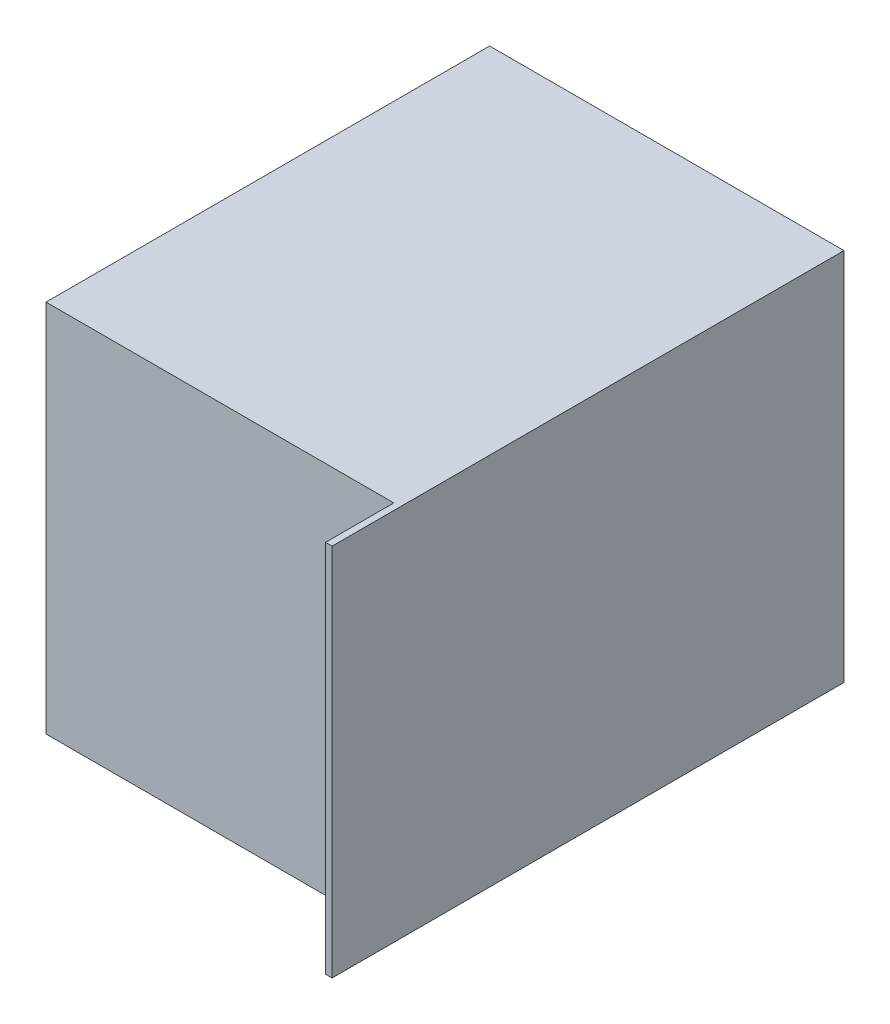
ISO-10303-21;
HEADER;
FILE_DESCRIPTION(('STEP AP214'),'2;1');
FILE_NAME('part.step','',(''),(''),'','','');
FILE_SCHEMA(('AUTOMOTIVE_DESIGN { 1 0 10303 214 1 1 1 1 }'));
ENDSEC;
DATA;
#1=APPLICATION_CONTEXT('core data for automotive mechanical design processes');
#2=APPLICATION_PROTOCOL_DEFINITION('international standard','automotive_design',2000,#1);
#3=PRODUCT_CONTEXT('',#1,'mechanical');
#4=PRODUCT('Part','Part','',(#3));
#5=PRODUCT_RELATED_PRODUCT_CATEGORY('part','',(#4));
#6=PRODUCT_DEFINITION_FORMATION('','',#4);
#7=PRODUCT_DEFINITION_CONTEXT('part definition',#1,'design');
#8=PRODUCT_DEFINITION('design','',#6,#7);
#9=PRODUCT_DEFINITION_SHAPE('','',#8);
#10=(LENGTH_UNIT() NAMED_UNIT(*) SI_UNIT(.MILLI.,.METRE.));
#11=(NAMED_UNIT(*) PLANE_ANGLE_UNIT() SI_UNIT($,.RADIAN.));
#12=(NAMED_UNIT(*) SI_UNIT($,.STERADIAN.) SOLID_ANGLE_UNIT());
#13=UNCERTAINTY_MEASURE_WITH_UNIT(LENGTH_MEASURE(1.E-05),#10,'distance_accuracy_value','');
#14=(GEOMETRIC_REPRESENTATION_CONTEXT(3) GLOBAL_UNCERTAINTY_ASSIGNED_CONTEXT((#13)) GLOBAL_UNIT_ASSIGNED_CONTEXT((#10,
#11,#12)) REPRESENTATION_CONTEXT('',''));
#15=CARTESIAN_POINT('',(0.,0.,0.));
#16=DIRECTION('',(0.,0.,1.));
#17=DIRECTION('',(1.,0.,0.));
#18=AXIS2_PLACEMENT_3D('',#15,#16,#17);
#19=CARTESIAN_POINT('',(12.5726141078839,57.,39.));
#20=DIRECTION('',(-1.,0.,0.));
#21=DIRECTION('',(0.,0.,1.));
#22=AXIS2_PLACEMENT_3D('',#19,#20,#21);
#23=PLANE('',#22);
#24=DIRECTION('',(0.,0.,-1.));
#25=VECTOR('',#24,1.);
#26=CARTESIAN_POINT('',(12.5726141078839,0.,39.));
#27=LINE('',#26,#25);
#28=CARTESIAN_POINT('',(12.5726141078839,0.,39.));
#29=VERTEX_POINT('',#28);
#30=CARTESIAN_POINT('',(12.5726141078839,0.,-39.));
#31=VERTEX_POINT('',#30);
#32=EDGE_CURVE('E117',#29,#31,#27,.T.);
#33=ORIENTED_EDGE('',*,*,#32,.T.);
#34=DIRECTION('',(0.,-1.,0.));
#35=VECTOR('',#34,1.);
#36=CARTESIAN_POINT('',(12.5726141078839,57.,-39.));
#37=LINE('',#36,#35);
#38=CARTESIAN_POINT('',(12.5726141078839,57.,-39.));
#39=VERTEX_POINT('',#38);
#40=EDGE_CURVE('E11',#39,#31,#37,.T.);
#41=ORIENTED_EDGE('',*,*,#40,.F.);
#42=DIRECTION('',(0.,0.,-1.));
#43=VECTOR('',#42,1.);
#44=CARTESIAN_POINT('',(12.5726141078839,57.,39.));
#45=LINE('',#44,#43);
#46=CARTESIAN_POINT('',(12.5726141078839,57.,39.));
#47=VERTEX_POINT('',#46);
#48=EDGE_CURVE('E128',#47,#39,#45,.T.);
#49=ORIENTED_EDGE('',*,*,#48,.F.);
#50=DIRECTION('',(0.,-1.,0.));
#51=VECTOR('',#50,1.);
#52=CARTESIAN_POINT('',(12.5726141078839,57.,39.));
#53=LINE('',#52,#51);
#54=EDGE_CURVE('E113',#47,#29,#53,.T.);
#55=ORIENTED_EDGE('',*,*,#54,.T.);
#56=EDGE_LOOP('',(#33,#41,#49,#55));
#57=FACE_BOUND('',#56,.T.);
#58=ADVANCED_FACE('F33',(#57),#23,.F.);
#59=CARTESIAN_POINT('',(-41.4273858921161,57.,-39.));
#60=DIRECTION('',(0.,0.,1.));
#61=DIRECTION('',(1.,0.,0.));
#62=AXIS2_PLACEMENT_3D('',#59,#60,#61);
#63=PLANE('',#62);
#64=DIRECTION('',(-1.,0.,0.));
#65=VECTOR('',#64,1.);
#66=CARTESIAN_POINT('',(-41.4273858921161,0.,-39.));
#67=LINE('',#66,#65);
#68=CARTESIAN_POINT('',(-41.4273858921161,0.,-39.));
#69=VERTEX_POINT('',#68);
#70=EDGE_CURVE('E120',#31,#69,#67,.T.);
#71=ORIENTED_EDGE('',*,*,#70,.T.);
#72=DIRECTION('',(0.,-1.,0.));
#73=VECTOR('',#72,1.);
#74=CARTESIAN_POINT('',(-41.4273858921161,57.,-39.));
#75=LINE('',#74,#73);
#76=CARTESIAN_POINT('',(-41.4273858921161,57.,-39.));
#77=VERTEX_POINT('',#76);
#78=EDGE_CURVE('E41',#77,#69,#75,.T.);
#79=ORIENTED_EDGE('',*,*,#78,.F.);
#80=DIRECTION('',(-1.,0.,0.));
#81=VECTOR('',#80,1.);
#82=CARTESIAN_POINT('',(-41.4273858921161,57.,-39.));
#83=LINE('',#82,#81);
#84=EDGE_CURVE('E86',#39,#77,#83,.T.);
#85=ORIENTED_EDGE('',*,*,#84,.F.);
#86=ORIENTED_EDGE('',*,*,#40,.T.);
#87=EDGE_LOOP('',(#71,#79,#85,#86));
#88=FACE_BOUND('',#87,.T.);
#89=ADVANCED_FACE('F152',(#88),#63,.F.);
#90=CARTESIAN_POINT('',(-41.4273858921161,57.,28.6));
#91=DIRECTION('',(1.,0.,0.));
#92=DIRECTION('',(0.,0.,-1.));
#93=AXIS2_PLACEMENT_3D('',#90,#91,#92);
#94=PLANE('',#93);
#95=DIRECTION('',(0.,0.,1.));
#96=VECTOR('',#95,1.);
#97=CARTESIAN_POINT('',(-41.4273858921161,0.,28.6));
#98=LINE('',#97,#96);
#99=CARTESIAN_POINT('',(-41.4273858921161,0.,28.6));
#100=VERTEX_POINT('',#99);
#101=EDGE_CURVE('E123',#69,#100,#98,.T.);
#102=ORIENTED_EDGE('',*,*,#101,.T.);
#103=DIRECTION('',(0.,-1.,0.));
#104=VECTOR('',#103,1.);
#105=CARTESIAN_POINT('',(-41.4273858921161,57.,28.6));
#106=LINE('',#105,#104);
#107=CARTESIAN_POINT('',(-41.4273858921161,57.,28.6));
#108=VERTEX_POINT('',#107);
#109=EDGE_CURVE('E108',#108,#100,#106,.T.);
#110=ORIENTED_EDGE('',*,*,#109,.F.);
#111=DIRECTION('',(0.,0.,1.));
#112=VECTOR('',#111,1.);
#113=CARTESIAN_POINT('',(-41.4273858921161,57.,28.6));
#114=LINE('',#113,#112);
#115=EDGE_CURVE('E99',#77,#108,#114,.T.);
#116=ORIENTED_EDGE('',*,*,#115,.F.);
#117=ORIENTED_EDGE('',*,*,#78,.T.);
#118=EDGE_LOOP('',(#102,#110,#116,#117));
#119=FACE_BOUND('',#118,.T.);
#120=ADVANCED_FACE('F134',(#119),#94,.F.);
#121=CARTESIAN_POINT('',(-41.4273858921161,57.,28.6));
#122=DIRECTION('',(0.,0.,-1.));
#123=DIRECTION('',(-1.,0.,0.));
#124=AXIS2_PLACEMENT_3D('',#121,#122,#123);
#125=PLANE('',#124);
#126=DIRECTION('',(1.,0.,0.));
#127=VECTOR('',#126,1.);
#128=CARTESIAN_POINT('',(-41.4273858921161,0.,28.6));
#129=LINE('',#128,#127);
#130=CARTESIAN_POINT('',(11.5726141078839,0.,28.6));
#131=VERTEX_POINT('',#130);
#132=EDGE_CURVE('E107',#100,#131,#129,.T.);
#133=ORIENTED_EDGE('',*,*,#132,.T.);
#134=DIRECTION('',(0.,-1.,0.));
#135=VECTOR('',#134,1.);
#136=CARTESIAN_POINT('',(11.5726141078839,57.,28.6));
#137=LINE('',#136,#135);
#138=CARTESIAN_POINT('',(11.5726141078839,57.,28.6));
#139=VERTEX_POINT('',#138);
#140=EDGE_CURVE('E104',#139,#131,#137,.T.);
#141=ORIENTED_EDGE('',*,*,#140,.F.);
#142=DIRECTION('',(1.,0.,0.));
#143=VECTOR('',#142,1.);
#144=CARTESIAN_POINT('',(-41.4273858921161,57.,28.6));
#145=LINE('',#144,#143);
#146=EDGE_CURVE('E93',#108,#139,#145,.T.);
#147=ORIENTED_EDGE('',*,*,#146,.F.);
#148=ORIENTED_EDGE('',*,*,#109,.T.);
#149=EDGE_LOOP('',(#133,#141,#147,#148));
#150=FACE_BOUND('',#149,.T.);
#151=ADVANCED_FACE('F105',(#150),#125,.F.);
#152=CARTESIAN_POINT('',(11.5726141078839,57.,28.6));
#153=DIRECTION('',(1.,0.,0.));
#154=DIRECTION('',(0.,0.,-1.));
#155=AXIS2_PLACEMENT_3D('',#152,#153,#154);
#156=PLANE('',#155);
#157=DIRECTION('',(0.,0.,1.));
#158=VECTOR('',#157,1.);
#159=CARTESIAN_POINT('',(11.5726141078839,0.,28.6));
#160=LINE('',#159,#158);
#161=CARTESIAN_POINT('',(11.5726141078839,0.,39.));
#162=VERTEX_POINT('',#161);
#163=EDGE_CURVE('E72',#131,#162,#160,.T.);
#164=ORIENTED_EDGE('',*,*,#163,.T.);
#165=DIRECTION('',(0.,-1.,0.));
#166=VECTOR('',#165,1.);
#167=CARTESIAN_POINT('',(11.5726141078839,57.,39.));
#168=LINE('',#167,#166);
#169=CARTESIAN_POINT('',(11.5726141078839,57.,39.));
#170=VERTEX_POINT('',#169);
#171=EDGE_CURVE('E109',#170,#162,#168,.T.);
#172=ORIENTED_EDGE('',*,*,#171,.F.);
#173=DIRECTION('',(0.,0.,1.));
#174=VECTOR('',#173,1.);
#175=CARTESIAN_POINT('',(11.5726141078839,57.,28.6));
#176=LINE('',#175,#174);
#177=EDGE_CURVE('E97',#139,#170,#176,.T.);
#178=ORIENTED_EDGE('',*,*,#177,.F.);
#179=ORIENTED_EDGE('',*,*,#140,.T.);
#180=EDGE_LOOP('',(#164,#172,#178,#179));
#181=FACE_BOUND('',#180,.T.);
#182=ADVANCED_FACE('F111',(#181),#156,.F.);
#183=CARTESIAN_POINT('',(11.5726141078839,57.,39.));
#184=DIRECTION('',(0.,0.,-1.));
#185=DIRECTION('',(-1.,0.,0.));
#186=AXIS2_PLACEMENT_3D('',#183,#184,#185);
#187=PLANE('',#186);
#188=DIRECTION('',(1.,0.,0.));
#189=VECTOR('',#188,1.);
#190=CARTESIAN_POINT('',(11.5726141078839,0.,39.));
#191=LINE('',#190,#189);
#192=EDGE_CURVE('E78',#162,#29,#191,.T.);
#193=ORIENTED_EDGE('',*,*,#192,.T.);
#194=ORIENTED_EDGE('',*,*,#54,.F.);
#195=DIRECTION('',(1.,0.,0.));
#196=VECTOR('',#195,1.);
#197=CARTESIAN_POINT('',(11.5726141078839,57.,39.));
#198=LINE('',#197,#196);
#199=EDGE_CURVE('E49',#170,#47,#198,.T.);
#200=ORIENTED_EDGE('',*,*,#199,.F.);
#201=ORIENTED_EDGE('',*,*,#171,.T.);
#202=EDGE_LOOP('',(#193,#194,#200,#201));
#203=FACE_BOUND('',#202,.T.);
#204=ADVANCED_FACE('F141',(#203),#187,.F.);
#205=CARTESIAN_POINT('',(0.,57.,0.));
#206=DIRECTION('',(0.,-1.,0.));
#207=DIRECTION('',(0.,0.,-1.));
#208=AXIS2_PLACEMENT_3D('',#205,#206,#207);
#209=PLANE('',#208);
#210=ORIENTED_EDGE('',*,*,#48,.T.);
#211=ORIENTED_EDGE('',*,*,#84,.T.);
#212=ORIENTED_EDGE('',*,*,#115,.T.);
#213=ORIENTED_EDGE('',*,*,#146,.T.);
#214=ORIENTED_EDGE('',*,*,#177,.T.);
#215=ORIENTED_EDGE('',*,*,#199,.T.);
#216=EDGE_LOOP('',(#210,#211,#212,#213,#214,#215));
#217=FACE_BOUND('',#216,.T.);
#218=ADVANCED_FACE('F95',(#217),#209,.F.);
#219=CARTESIAN_POINT('',(0.,0.,0.));
#220=DIRECTION('',(0.,-1.,0.));
#221=DIRECTION('',(0.,0.,-1.));
#222=AXIS2_PLACEMENT_3D('',#219,#220,#221);
#223=PLANE('',#222);
#224=CARTESIAN_POINT('',(-31.6773858921161,0.,12.75));
#225=DIRECTION('',(0.,-1.,0.));
#226=DIRECTION('',(0.,0.,-1.));
#227=AXIS2_PLACEMENT_3D('',#224,#225,#226);
#228=CIRCLE('',#227,1.75);
#229=CARTESIAN_POINT('',(-31.6773858921161,0.,11.));
#230=VERTEX_POINT('',#229);
#231=EDGE_CURVE('E214',#230,#230,#228,.T.);
#232=ORIENTED_EDGE('',*,*,#231,.F.);
#233=EDGE_LOOP('',(#232));
#234=FACE_BOUND('',#233,.T.);
#235=ORIENTED_EDGE('',*,*,#32,.F.);
#236=ORIENTED_EDGE('',*,*,#192,.F.);
#237=ORIENTED_EDGE('',*,*,#163,.F.);
#238=ORIENTED_EDGE('',*,*,#132,.F.);
#239=ORIENTED_EDGE('',*,*,#101,.F.);
#240=ORIENTED_EDGE('',*,*,#70,.F.);
#241=EDGE_LOOP('',(#235,#236,#237,#238,#239,#240));
#242=FACE_BOUND('',#241,.T.);
#243=ADVANCED_FACE('F137',(#234,#242),#223,.T.);
#244=CARTESIAN_POINT('',(-31.6773858921161,10.,12.75));
#245=DIRECTION('',(0.,-1.,0.));
#246=DIRECTION('',(0.,0.,-1.));
#247=AXIS2_PLACEMENT_3D('',#244,#245,#246);
#248=CYLINDRICAL_SURFACE('',#247,1.75);
#249=CARTESIAN_POINT('',(-31.6773858921161,10.,12.75));
#250=DIRECTION('',(0.,-1.,0.));
#251=DIRECTION('',(0.,0.,-1.));
#252=AXIS2_PLACEMENT_3D('',#249,#250,#251);
#253=CIRCLE('',#252,1.75);
#254=CARTESIAN_POINT('',(-31.6773858921161,10.,11.));
#255=VERTEX_POINT('',#254);
#256=EDGE_CURVE('E121',#255,#255,#253,.T.);
#257=ORIENTED_EDGE('',*,*,#256,.F.);
#258=EDGE_LOOP('',(#257));
#259=FACE_BOUND('',#258,.T.);
#260=ORIENTED_EDGE('',*,*,#231,.T.);
#261=EDGE_LOOP('',(#260));
#262=FACE_BOUND('',#261,.T.);
#263=ADVANCED_FACE('F189',(#259,#262),#248,.F.);
#264=CARTESIAN_POINT('',(-31.6773858921161,10.,12.75));
#265=DIRECTION('',(0.,-1.,0.));
#266=DIRECTION('',(0.,0.,-1.));
#267=AXIS2_PLACEMENT_3D('',#264,#265,#266);
#268=PLANE('',#267);
#269=ORIENTED_EDGE('',*,*,#256,.T.);
#270=EDGE_LOOP('',(#269));
#271=FACE_BOUND('',#270,.T.);
#272=ADVANCED_FACE('F198',(#271),#268,.T.);
#273=CLOSED_SHELL('',(#58,#89,#120,#151,#182,#204,#218,#243,#263,#272));
#274=MANIFOLD_SOLID_BREP('B2',#273);
#275=ADVANCED_BREP_SHAPE_REPRESENTATION('',(#18,#274),#14);
#276=SHAPE_DEFINITION_REPRESENTATION(#9,#275);
ENDSEC;
END-ISO-10303-21;
